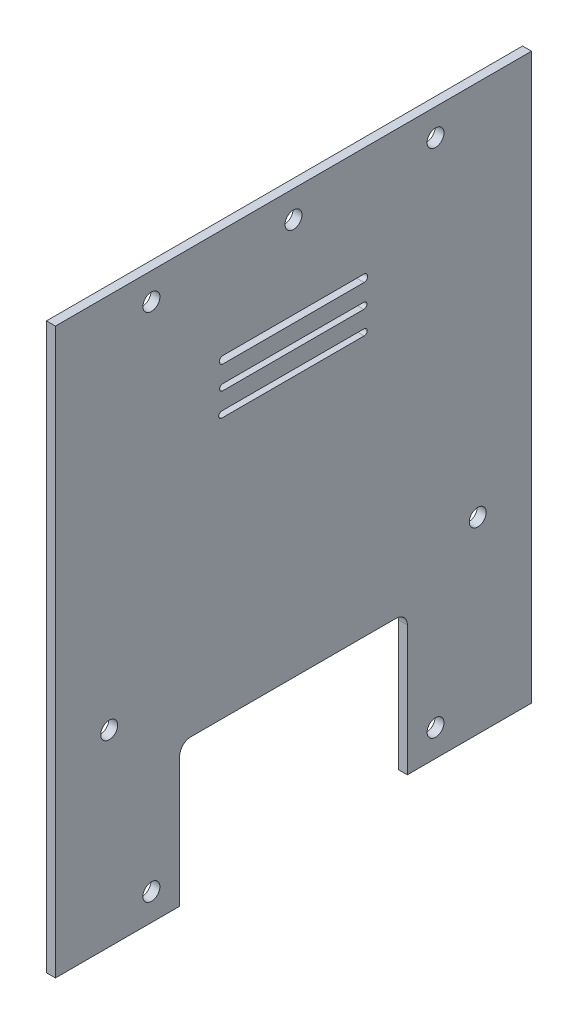
ISO-10303-21;
HEADER;
FILE_DESCRIPTION(('STEP AP214'),'2;1');
FILE_NAME('part.step','',(''),(''),'','','');
FILE_SCHEMA(('AUTOMOTIVE_DESIGN { 1 0 10303 214 1 1 1 1 }'));
ENDSEC;
DATA;
#1=APPLICATION_CONTEXT('core data for automotive mechanical design processes');
#2=APPLICATION_PROTOCOL_DEFINITION('international standard','automotive_design',2000,#1);
#3=PRODUCT_CONTEXT('',#1,'mechanical');
#4=PRODUCT('Part','Part','',(#3));
#5=PRODUCT_RELATED_PRODUCT_CATEGORY('part','',(#4));
#6=PRODUCT_DEFINITION_FORMATION('','',#4);
#7=PRODUCT_DEFINITION_CONTEXT('part definition',#1,'design');
#8=PRODUCT_DEFINITION('design','',#6,#7);
#9=PRODUCT_DEFINITION_SHAPE('','',#8);
#10=(LENGTH_UNIT() NAMED_UNIT(*) SI_UNIT(.MILLI.,.METRE.));
#11=(NAMED_UNIT(*) PLANE_ANGLE_UNIT() SI_UNIT($,.RADIAN.));
#12=(NAMED_UNIT(*) SI_UNIT($,.STERADIAN.) SOLID_ANGLE_UNIT());
#13=UNCERTAINTY_MEASURE_WITH_UNIT(LENGTH_MEASURE(1.E-05),#10,'distance_accuracy_value','');
#14=(GEOMETRIC_REPRESENTATION_CONTEXT(3) GLOBAL_UNCERTAINTY_ASSIGNED_CONTEXT((#13)) GLOBAL_UNIT_ASSIGNED_CONTEXT((#10,
#11,#12)) REPRESENTATION_CONTEXT('',''));
#15=CARTESIAN_POINT('',(0.,0.,0.));
#16=DIRECTION('',(0.,0.,1.));
#17=DIRECTION('',(1.,0.,0.));
#18=AXIS2_PLACEMENT_3D('',#15,#16,#17);
#19=CARTESIAN_POINT('',(111.95685789838,104.762,-123.291083719098));
#20=DIRECTION('',(1.,0.,0.));
#21=DIRECTION('',(0.,0.,-1.));
#22=AXIS2_PLACEMENT_3D('',#19,#20,#21);
#23=CYLINDRICAL_SURFACE('',#22,3.32740000005567);
#24=DIRECTION('',(1.,0.,0.));
#25=VECTOR('',#24,1.);
#26=CARTESIAN_POINT('',(111.95685789838,104.81359224748,-119.964083719043));
#27=LINE('',#26,#25);
#28=CARTESIAN_POINT('',(113.54485789838,104.813592247502,-119.964083719043));
#29=VERTEX_POINT('',#28);
#30=CARTESIAN_POINT('',(111.95685789838,104.813592247502,-119.964083719043));
#31=VERTEX_POINT('',#30);
#32=EDGE_CURVE('E196',#29,#31,#27,.F.);
#33=ORIENTED_EDGE('',*,*,#32,.F.);
#34=CARTESIAN_POINT('',(113.54485789838,104.762,-123.291083719098));
#35=DIRECTION('',(1.,0.,0.));
#36=DIRECTION('',(0.,0.,-1.));
#37=AXIS2_PLACEMENT_3D('',#34,#35,#36);
#38=CIRCLE('',#37,3.32740000005567);
#39=CARTESIAN_POINT('',(113.54485789838,104.710407752498,-119.964083719043));
#40=VERTEX_POINT('',#39);
#41=EDGE_CURVE('E20',#40,#29,#38,.F.);
#42=ORIENTED_EDGE('',*,*,#41,.F.);
#43=DIRECTION('',(1.,0.,0.));
#44=VECTOR('',#43,1.);
#45=CARTESIAN_POINT('',(111.95685789838,104.71040775252,-119.964083719043));
#46=LINE('',#45,#44);
#47=CARTESIAN_POINT('',(111.95685789838,104.710407752499,-119.964083719043));
#48=VERTEX_POINT('',#47);
#49=EDGE_CURVE('E223',#48,#40,#46,.T.);
#50=ORIENTED_EDGE('',*,*,#49,.F.);
#51=CARTESIAN_POINT('',(111.95685789838,104.762,-123.291083719098));
#52=DIRECTION('',(1.,0.,0.));
#53=DIRECTION('',(0.,0.,-1.));
#54=AXIS2_PLACEMENT_3D('',#51,#52,#53);
#55=CIRCLE('',#54,3.32740000005567);
#56=EDGE_CURVE('E268',#48,#31,#55,.F.);
#57=ORIENTED_EDGE('',*,*,#56,.T.);
#58=EDGE_LOOP('',(#33,#42,#50,#57));
#59=FACE_BOUND('',#58,.T.);
#60=ADVANCED_FACE('F17',(#59),#23,.F.);
#61=CARTESIAN_POINT('',(111.95685789838,59.525,-77.8015837190426));
#62=DIRECTION('',(1.,0.,0.));
#63=DIRECTION('',(0.,0.,-1.));
#64=AXIS2_PLACEMENT_3D('',#61,#62,#63);
#65=PLANE('',#64);
#66=CARTESIAN_POINT('',(111.95685789838,14.2875,-52.6390837190426));
#67=DIRECTION('',(1.,0.,0.));
#68=DIRECTION('',(0.,0.,-1.));
#69=AXIS2_PLACEMENT_3D('',#66,#67,#68);
#70=CIRCLE('',#69,1.5);
#71=CARTESIAN_POINT('',(111.95685789838,14.2875,-54.1390837190426));
#72=VERTEX_POINT('',#71);
#73=EDGE_CURVE('E358',#72,#72,#70,.T.);
#74=ORIENTED_EDGE('',*,*,#73,.T.);
#75=EDGE_LOOP('',(#74));
#76=FACE_BOUND('',#75,.T.);
#77=CARTESIAN_POINT('',(111.95685789838,104.7625,-52.6390837190426));
#78=DIRECTION('',(1.,0.,0.));
#79=DIRECTION('',(0.,0.,-1.));
#80=AXIS2_PLACEMENT_3D('',#77,#78,#79);
#81=CIRCLE('',#80,1.5);
#82=CARTESIAN_POINT('',(111.95685789838,104.7625,-54.1390837190426));
#83=VERTEX_POINT('',#82);
#84=EDGE_CURVE('E355',#83,#83,#81,.T.);
#85=ORIENTED_EDGE('',*,*,#84,.T.);
#86=EDGE_LOOP('',(#85));
#87=FACE_BOUND('',#86,.T.);
#88=CARTESIAN_POINT('',(111.95685789838,14.2875,-102.964083719043));
#89=DIRECTION('',(1.,0.,0.));
#90=DIRECTION('',(0.,0.,-1.));
#91=AXIS2_PLACEMENT_3D('',#88,#89,#90);
#92=CIRCLE('',#91,1.5);
#93=CARTESIAN_POINT('',(111.95685789838,14.2875,-104.464083719043));
#94=VERTEX_POINT('',#93);
#95=EDGE_CURVE('E352',#94,#94,#92,.T.);
#96=ORIENTED_EDGE('',*,*,#95,.T.);
#97=EDGE_LOOP('',(#96));
#98=FACE_BOUND('',#97,.T.);
#99=CARTESIAN_POINT('',(111.95685789838,104.7625,-77.8015837190426));
#100=DIRECTION('',(1.,0.,0.));
#101=DIRECTION('',(0.,0.,-1.));
#102=AXIS2_PLACEMENT_3D('',#99,#100,#101);
#103=CIRCLE('',#102,1.5);
#104=CARTESIAN_POINT('',(111.95685789838,104.7625,-79.3015837190426));
#105=VERTEX_POINT('',#104);
#106=EDGE_CURVE('E349',#105,#105,#103,.T.);
#107=ORIENTED_EDGE('',*,*,#106,.T.);
#108=EDGE_LOOP('',(#107));
#109=FACE_BOUND('',#108,.T.);
#110=CARTESIAN_POINT('',(111.95685789838,104.7625,-102.964083719043));
#111=DIRECTION('',(1.,0.,0.));
#112=DIRECTION('',(0.,0.,-1.));
#113=AXIS2_PLACEMENT_3D('',#110,#111,#112);
#114=CIRCLE('',#113,1.5);
#115=CARTESIAN_POINT('',(111.95685789838,104.7625,-104.464083719043));
#116=VERTEX_POINT('',#115);
#117=EDGE_CURVE('E346',#116,#116,#114,.T.);
#118=ORIENTED_EDGE('',*,*,#117,.T.);
#119=EDGE_LOOP('',(#118));
#120=FACE_BOUND('',#119,.T.);
#121=CARTESIAN_POINT('',(111.95685789838,81.225,-90.3185438285447));
#122=DIRECTION('',(-1.,0.,0.));
#123=DIRECTION('',(0.,0.,1.));
#124=AXIS2_PLACEMENT_3D('',#121,#122,#123);
#125=CIRCLE('',#124,0.549999999999997);
#126=CARTESIAN_POINT('',(111.95685789838,80.675,-90.3185438285447));
#127=VERTEX_POINT('',#126);
#128=CARTESIAN_POINT('',(111.95685789838,81.775,-90.3185438285447));
#129=VERTEX_POINT('',#128);
#130=EDGE_CURVE('E361',#127,#129,#125,.F.);
#131=ORIENTED_EDGE('',*,*,#130,.T.);
#132=DIRECTION('',(0.,0.,1.));
#133=VECTOR('',#132,1.);
#134=CARTESIAN_POINT('',(111.95685789838,81.775,-65.0955161721386));
#135=LINE('',#134,#133);
#136=CARTESIAN_POINT('',(111.95685789838,81.775,-65.0955161721386));
#137=VERTEX_POINT('',#136);
#138=EDGE_CURVE('E241',#129,#137,#135,.T.);
#139=ORIENTED_EDGE('',*,*,#138,.T.);
#140=CARTESIAN_POINT('',(111.95685789838,81.225,-65.0955161721386));
#141=DIRECTION('',(-1.,0.,0.));
#142=DIRECTION('',(0.,0.,1.));
#143=AXIS2_PLACEMENT_3D('',#140,#141,#142);
#144=CIRCLE('',#143,0.549999999999979);
#145=CARTESIAN_POINT('',(111.95685789838,80.675,-65.0955161721386));
#146=VERTEX_POINT('',#145);
#147=EDGE_CURVE('E365',#137,#146,#144,.F.);
#148=ORIENTED_EDGE('',*,*,#147,.T.);
#149=DIRECTION('',(0.,0.,-1.));
#150=VECTOR('',#149,1.);
#151=CARTESIAN_POINT('',(111.95685789838,80.675,-90.3185438285447));
#152=LINE('',#151,#150);
#153=EDGE_CURVE('E237',#146,#127,#152,.T.);
#154=ORIENTED_EDGE('',*,*,#153,.T.);
#155=EDGE_LOOP('',(#131,#139,#148,#154));
#156=FACE_BOUND('',#155,.T.);
#157=CARTESIAN_POINT('',(111.95685789838,85.325,-90.2649355778327));
#158=DIRECTION('',(-1.,0.,0.));
#159=DIRECTION('',(0.,0.,1.));
#160=AXIS2_PLACEMENT_3D('',#157,#158,#159);
#161=CIRCLE('',#160,0.549999999999997);
#162=CARTESIAN_POINT('',(111.95685789838,84.775,-90.2649355778327));
#163=VERTEX_POINT('',#162);
#164=CARTESIAN_POINT('',(111.95685789838,85.875,-90.2649355778327));
#165=VERTEX_POINT('',#164);
#166=EDGE_CURVE('E240',#163,#165,#161,.F.);
#167=ORIENTED_EDGE('',*,*,#166,.T.);
#168=DIRECTION('',(0.,0.,1.));
#169=VECTOR('',#168,1.);
#170=CARTESIAN_POINT('',(111.95685789838,85.875,-65.2649355778327));
#171=LINE('',#170,#169);
#172=CARTESIAN_POINT('',(111.95685789838,85.875,-65.2649355778327));
#173=VERTEX_POINT('',#172);
#174=EDGE_CURVE('E249',#165,#173,#171,.T.);
#175=ORIENTED_EDGE('',*,*,#174,.T.);
#176=CARTESIAN_POINT('',(111.95685789838,85.325,-65.2649355778327));
#177=DIRECTION('',(-1.,0.,0.));
#178=DIRECTION('',(0.,0.,1.));
#179=AXIS2_PLACEMENT_3D('',#176,#177,#178);
#180=CIRCLE('',#179,0.549999999999997);
#181=CARTESIAN_POINT('',(111.95685789838,84.775,-65.2649355778327));
#182=VERTEX_POINT('',#181);
#183=EDGE_CURVE('E371',#173,#182,#180,.F.);
#184=ORIENTED_EDGE('',*,*,#183,.T.);
#185=DIRECTION('',(0.,0.,-1.));
#186=VECTOR('',#185,1.);
#187=CARTESIAN_POINT('',(111.95685789838,84.775,-90.2649355778327));
#188=LINE('',#187,#186);
#189=EDGE_CURVE('E245',#182,#163,#188,.T.);
#190=ORIENTED_EDGE('',*,*,#189,.T.);
#191=EDGE_LOOP('',(#167,#175,#184,#190));
#192=FACE_BOUND('',#191,.T.);
#193=CARTESIAN_POINT('',(111.95685789838,89.525,-90.3015837190426));
#194=DIRECTION('',(-1.,0.,0.));
#195=DIRECTION('',(0.,0.,1.));
#196=AXIS2_PLACEMENT_3D('',#193,#194,#195);
#197=CIRCLE('',#196,0.649999999999995);
#198=CARTESIAN_POINT('',(111.95685789838,88.875,-90.3015837190426));
#199=VERTEX_POINT('',#198);
#200=CARTESIAN_POINT('',(111.95685789838,90.175,-90.3015837190426));
#201=VERTEX_POINT('',#200);
#202=EDGE_CURVE('E248',#199,#201,#197,.F.);
#203=ORIENTED_EDGE('',*,*,#202,.T.);
#204=DIRECTION('',(0.,0.,1.));
#205=VECTOR('',#204,1.);
#206=CARTESIAN_POINT('',(111.95685789838,90.175,-65.3015837190426));
#207=LINE('',#206,#205);
#208=CARTESIAN_POINT('',(111.95685789838,90.175,-65.3015837190426));
#209=VERTEX_POINT('',#208);
#210=EDGE_CURVE('E258',#201,#209,#207,.T.);
#211=ORIENTED_EDGE('',*,*,#210,.T.);
#212=CARTESIAN_POINT('',(111.95685789838,89.525,-65.3015837190426));
#213=DIRECTION('',(-1.,0.,0.));
#214=DIRECTION('',(0.,0.,1.));
#215=AXIS2_PLACEMENT_3D('',#212,#213,#214);
#216=CIRCLE('',#215,0.649999999999995);
#217=CARTESIAN_POINT('',(111.95685789838,88.875,-65.3015837190426));
#218=VERTEX_POINT('',#217);
#219=EDGE_CURVE('E377',#209,#218,#216,.F.);
#220=ORIENTED_EDGE('',*,*,#219,.T.);
#221=DIRECTION('',(0.,0.,-1.));
#222=VECTOR('',#221,1.);
#223=CARTESIAN_POINT('',(111.95685789838,88.875,-90.3015837190426));
#224=LINE('',#223,#222);
#225=EDGE_CURVE('E254',#218,#199,#224,.T.);
#226=ORIENTED_EDGE('',*,*,#225,.T.);
#227=EDGE_LOOP('',(#203,#211,#220,#226));
#228=FACE_BOUND('',#227,.T.);
#229=CARTESIAN_POINT('',(111.95685789838,42.8129999999999,-110.439083719043));
#230=DIRECTION('',(1.,0.,0.));
#231=DIRECTION('',(0.,0.,-1.));
#232=AXIS2_PLACEMENT_3D('',#229,#230,#231);
#233=CIRCLE('',#232,1.5);
#234=CARTESIAN_POINT('',(111.95685789838,42.8129999999999,-111.939083719043));
#235=VERTEX_POINT('',#234);
#236=EDGE_CURVE('E257',#235,#235,#233,.T.);
#237=ORIENTED_EDGE('',*,*,#236,.T.);
#238=EDGE_LOOP('',(#237));
#239=FACE_BOUND('',#238,.T.);
#240=CARTESIAN_POINT('',(111.95685789838,42.8129999999999,-45.1640837190423));
#241=DIRECTION('',(1.,0.,0.));
#242=DIRECTION('',(0.,0.,-1.));
#243=AXIS2_PLACEMENT_3D('',#240,#241,#242);
#244=CIRCLE('',#243,1.5);
#245=CARTESIAN_POINT('',(111.95685789838,42.8129999999999,-46.6640837190423));
#246=VERTEX_POINT('',#245);
#247=EDGE_CURVE('E382',#246,#246,#244,.T.);
#248=ORIENTED_EDGE('',*,*,#247,.T.);
#249=EDGE_LOOP('',(#248));
#250=FACE_BOUND('',#249,.T.);
#251=CARTESIAN_POINT('',(111.95685789838,32.525,-95.9640837190426));
#252=DIRECTION('',(-1.,0.,0.));
#253=DIRECTION('',(0.,0.,1.));
#254=AXIS2_PLACEMENT_3D('',#251,#252,#253);
#255=CIRCLE('',#254,2.);
#256=CARTESIAN_POINT('',(111.95685789838,32.525,-97.9640837190426));
#257=VERTEX_POINT('',#256);
#258=CARTESIAN_POINT('',(111.95685789838,34.525,-95.9640837190426));
#259=VERTEX_POINT('',#258);
#260=EDGE_CURVE('E386',#257,#259,#255,.F.);
#261=ORIENTED_EDGE('',*,*,#260,.T.);
#262=DIRECTION('',(0.,0.,1.));
#263=VECTOR('',#262,1.);
#264=CARTESIAN_POINT('',(111.95685789838,34.525,-57.6390837190426));
#265=LINE('',#264,#263);
#266=CARTESIAN_POINT('',(111.95685789838,34.525,-59.6390837190426));
#267=VERTEX_POINT('',#266);
#268=EDGE_CURVE('E263',#259,#267,#265,.T.);
#269=ORIENTED_EDGE('',*,*,#268,.T.);
#270=CARTESIAN_POINT('',(111.95685789838,32.525,-59.6390837190426));
#271=DIRECTION('',(-1.,0.,0.));
#272=DIRECTION('',(0.,0.,1.));
#273=AXIS2_PLACEMENT_3D('',#270,#271,#272);
#274=CIRCLE('',#273,2.);
#275=CARTESIAN_POINT('',(111.95685789838,32.525,-57.6390837190426));
#276=VERTEX_POINT('',#275);
#277=EDGE_CURVE('E389',#267,#276,#274,.F.);
#278=ORIENTED_EDGE('',*,*,#277,.T.);
#279=DIRECTION('',(0.,1.,0.));
#280=VECTOR('',#279,1.);
#281=CARTESIAN_POINT('',(111.95685789838,9.52500000000001,-57.6390837190426));
#282=LINE('',#281,#280);
#283=CARTESIAN_POINT('',(111.95685789838,9.52500000000001,-57.6390837190426));
#284=VERTEX_POINT('',#283);
#285=EDGE_CURVE('E271',#276,#284,#282,.F.);
#286=ORIENTED_EDGE('',*,*,#285,.T.);
#287=DIRECTION('',(0.,0.,-1.));
#288=VECTOR('',#287,1.);
#289=CARTESIAN_POINT('',(111.95685789838,9.525,-35.6390837190426));
#290=LINE('',#289,#288);
#291=CARTESIAN_POINT('',(111.95685789838,9.525,-35.6390837190426));
#292=VERTEX_POINT('',#291);
#293=EDGE_CURVE('E274',#292,#284,#290,.T.);
#294=ORIENTED_EDGE('',*,*,#293,.F.);
#295=DIRECTION('',(0.,-1.,0.));
#296=VECTOR('',#295,1.);
#297=CARTESIAN_POINT('',(111.95685789838,109.525,-35.6390837190426));
#298=LINE('',#297,#296);
#299=CARTESIAN_POINT('',(111.95685789838,109.525,-35.6390837190426));
#300=VERTEX_POINT('',#299);
#301=EDGE_CURVE('E191',#300,#292,#298,.T.);
#302=ORIENTED_EDGE('',*,*,#301,.F.);
#303=DIRECTION('',(0.,0.,1.));
#304=VECTOR('',#303,1.);
#305=CARTESIAN_POINT('',(111.95685789838,109.525,-119.964083719043));
#306=LINE('',#305,#304);
#307=CARTESIAN_POINT('',(111.95685789838,109.525,-119.964083719043));
#308=VERTEX_POINT('',#307);
#309=EDGE_CURVE('E185',#308,#300,#306,.T.);
#310=ORIENTED_EDGE('',*,*,#309,.F.);
#311=DIRECTION('',(0.,1.,0.));
#312=VECTOR('',#311,1.);
#313=CARTESIAN_POINT('',(111.95685789838,104.81359224748,-119.964083719043));
#314=LINE('',#313,#312);
#315=EDGE_CURVE('E188',#31,#308,#314,.T.);
#316=ORIENTED_EDGE('',*,*,#315,.F.);
#317=ORIENTED_EDGE('',*,*,#56,.F.);
#318=DIRECTION('',(0.,1.,0.));
#319=VECTOR('',#318,1.);
#320=CARTESIAN_POINT('',(111.95685789838,9.52500000000001,-119.964083719043));
#321=LINE('',#320,#319);
#322=CARTESIAN_POINT('',(111.95685789838,9.52500000000001,-119.964083719043));
#323=VERTEX_POINT('',#322);
#324=EDGE_CURVE('E289',#323,#48,#321,.T.);
#325=ORIENTED_EDGE('',*,*,#324,.F.);
#326=DIRECTION('',(0.,0.,-1.));
#327=VECTOR('',#326,1.);
#328=CARTESIAN_POINT('',(111.95685789838,9.525,-35.6390837190426));
#329=LINE('',#328,#327);
#330=CARTESIAN_POINT('',(111.95685789838,9.52500000000001,-97.9640837190426));
#331=VERTEX_POINT('',#330);
#332=EDGE_CURVE('E233',#331,#323,#329,.T.);
#333=ORIENTED_EDGE('',*,*,#332,.F.);
#334=DIRECTION('',(0.,1.,0.));
#335=VECTOR('',#334,1.);
#336=CARTESIAN_POINT('',(111.95685789838,34.525,-97.9640837190426));
#337=LINE('',#336,#335);
#338=EDGE_CURVE('E234',#331,#257,#337,.T.);
#339=ORIENTED_EDGE('',*,*,#338,.T.);
#340=EDGE_LOOP('',(#261,#269,#278,#286,#294,#302,#310,#316,#317,#325,#333,#339));
#341=FACE_BOUND('',#340,.T.);
#342=ADVANCED_FACE('F187',(#76,#87,#98,#109,#120,#156,#192,#228,#239,#250,#341),#65,.F.);
#343=CARTESIAN_POINT('',(113.54485789838,34.525,-97.9640837190426));
#344=DIRECTION('',(0.,0.,-1.));
#345=DIRECTION('',(-1.,0.,0.));
#346=AXIS2_PLACEMENT_3D('',#343,#344,#345);
#347=PLANE('',#346);
#348=ORIENTED_EDGE('',*,*,#338,.F.);
#349=DIRECTION('',(1.,0.,0.));
#350=VECTOR('',#349,1.);
#351=CARTESIAN_POINT('',(111.95685789838,9.52500000000001,-97.9640837190426));
#352=LINE('',#351,#350);
#353=CARTESIAN_POINT('',(113.54485789838,9.52500000000001,-97.9640837190426));
#354=VERTEX_POINT('',#353);
#355=EDGE_CURVE('E230',#354,#331,#352,.F.);
#356=ORIENTED_EDGE('',*,*,#355,.F.);
#357=DIRECTION('',(0.,1.,0.));
#358=VECTOR('',#357,1.);
#359=CARTESIAN_POINT('',(113.54485789838,59.525,-97.9640837190426));
#360=LINE('',#359,#358);
#361=CARTESIAN_POINT('',(113.54485789838,32.525,-97.9640837190426));
#362=VERTEX_POINT('',#361);
#363=EDGE_CURVE('E227',#362,#354,#360,.F.);
#364=ORIENTED_EDGE('',*,*,#363,.F.);
#365=DIRECTION('',(-1.,0.,0.));
#366=VECTOR('',#365,1.);
#367=CARTESIAN_POINT('',(113.54485789838,32.525,-97.9640837190426));
#368=LINE('',#367,#366);
#369=EDGE_CURVE('E388',#362,#257,#368,.T.);
#370=ORIENTED_EDGE('',*,*,#369,.T.);
#371=EDGE_LOOP('',(#348,#356,#364,#370));
#372=FACE_BOUND('',#371,.T.);
#373=ADVANCED_FACE('F398',(#372),#347,.F.);
#374=CARTESIAN_POINT('',(111.95685789838,9.525,-35.6390837190426));
#375=DIRECTION('',(0.,-1.,0.));
#376=DIRECTION('',(0.,0.,-1.));
#377=AXIS2_PLACEMENT_3D('',#374,#375,#376);
#378=PLANE('',#377);
#379=DIRECTION('',(1.,0.,0.));
#380=VECTOR('',#379,1.);
#381=CARTESIAN_POINT('',(111.95685789838,9.52500000000001,-119.964083719043));
#382=LINE('',#381,#380);
#383=CARTESIAN_POINT('',(113.54485789838,9.52500000000001,-119.964083719043));
#384=VERTEX_POINT('',#383);
#385=EDGE_CURVE('E157',#384,#323,#382,.F.);
#386=ORIENTED_EDGE('',*,*,#385,.F.);
#387=DIRECTION('',(0.,0.,-1.));
#388=VECTOR('',#387,1.);
#389=CARTESIAN_POINT('',(113.54485789838,9.52500000000001,-77.8015837190426));
#390=LINE('',#389,#388);
#391=EDGE_CURVE('E224',#354,#384,#390,.T.);
#392=ORIENTED_EDGE('',*,*,#391,.F.);
#393=ORIENTED_EDGE('',*,*,#355,.T.);
#394=ORIENTED_EDGE('',*,*,#332,.T.);
#395=EDGE_LOOP('',(#386,#392,#393,#394));
#396=FACE_BOUND('',#395,.T.);
#397=ADVANCED_FACE('F513',(#396),#378,.T.);
#398=CARTESIAN_POINT('',(111.95685789838,9.52500000000001,-119.964083719043));
#399=DIRECTION('',(0.,0.,-1.));
#400=DIRECTION('',(0.,1.,0.));
#401=AXIS2_PLACEMENT_3D('',#398,#399,#400);
#402=PLANE('',#401);
#403=DIRECTION('',(0.,1.,0.));
#404=VECTOR('',#403,1.);
#405=CARTESIAN_POINT('',(113.54485789838,59.525,-119.964083719043));
#406=LINE('',#405,#404);
#407=EDGE_CURVE('E218',#384,#40,#406,.T.);
#408=ORIENTED_EDGE('',*,*,#407,.F.);
#409=ORIENTED_EDGE('',*,*,#385,.T.);
#410=ORIENTED_EDGE('',*,*,#324,.T.);
#411=ORIENTED_EDGE('',*,*,#49,.T.);
#412=EDGE_LOOP('',(#408,#409,#410,#411));
#413=FACE_BOUND('',#412,.T.);
#414=ADVANCED_FACE('F510',(#413),#402,.T.);
#415=CARTESIAN_POINT('',(111.95685789838,104.81359224748,-119.964083719043));
#416=DIRECTION('',(0.,0.,-1.));
#417=DIRECTION('',(0.,1.,0.));
#418=AXIS2_PLACEMENT_3D('',#415,#416,#417);
#419=PLANE('',#418);
#420=DIRECTION('',(0.,1.,0.));
#421=VECTOR('',#420,1.);
#422=CARTESIAN_POINT('',(113.54485789838,59.525,-119.964083719043));
#423=LINE('',#422,#421);
#424=CARTESIAN_POINT('',(113.54485789838,109.525,-119.964083719043));
#425=VERTEX_POINT('',#424);
#426=EDGE_CURVE('E216',#29,#425,#423,.T.);
#427=ORIENTED_EDGE('',*,*,#426,.F.);
#428=ORIENTED_EDGE('',*,*,#32,.T.);
#429=ORIENTED_EDGE('',*,*,#315,.T.);
#430=DIRECTION('',(1.,0.,0.));
#431=VECTOR('',#430,1.);
#432=CARTESIAN_POINT('',(111.95685789838,109.525,-119.964083719043));
#433=LINE('',#432,#431);
#434=EDGE_CURVE('E195',#425,#308,#433,.F.);
#435=ORIENTED_EDGE('',*,*,#434,.F.);
#436=EDGE_LOOP('',(#427,#428,#429,#435));
#437=FACE_BOUND('',#436,.T.);
#438=ADVANCED_FACE('F200',(#437),#419,.T.);
#439=CARTESIAN_POINT('',(111.95685789838,109.525,-119.964083719043));
#440=DIRECTION('',(0.,1.,0.));
#441=DIRECTION('',(0.,0.,1.));
#442=AXIS2_PLACEMENT_3D('',#439,#440,#441);
#443=PLANE('',#442);
#444=DIRECTION('',(0.,0.,-1.));
#445=VECTOR('',#444,1.);
#446=CARTESIAN_POINT('',(113.54485789838,109.525,-77.8015837190426));
#447=LINE('',#446,#445);
#448=CARTESIAN_POINT('',(113.54485789838,109.525,-35.6390837190426));
#449=VERTEX_POINT('',#448);
#450=EDGE_CURVE('E205',#425,#449,#447,.F.);
#451=ORIENTED_EDGE('',*,*,#450,.F.);
#452=ORIENTED_EDGE('',*,*,#434,.T.);
#453=ORIENTED_EDGE('',*,*,#309,.T.);
#454=DIRECTION('',(1.,0.,0.));
#455=VECTOR('',#454,1.);
#456=CARTESIAN_POINT('',(111.95685789838,109.525,-35.6390837190426));
#457=LINE('',#456,#455);
#458=EDGE_CURVE('E208',#449,#300,#457,.F.);
#459=ORIENTED_EDGE('',*,*,#458,.F.);
#460=EDGE_LOOP('',(#451,#452,#453,#459));
#461=FACE_BOUND('',#460,.T.);
#462=ADVANCED_FACE('F203',(#461),#443,.T.);
#463=CARTESIAN_POINT('',(111.95685789838,109.525,-35.6390837190426));
#464=DIRECTION('',(0.,0.,1.));
#465=DIRECTION('',(0.,-1.,0.));
#466=AXIS2_PLACEMENT_3D('',#463,#464,#465);
#467=PLANE('',#466);
#468=DIRECTION('',(0.,1.,0.));
#469=VECTOR('',#468,1.);
#470=CARTESIAN_POINT('',(113.54485789838,59.525,-35.6390837190426));
#471=LINE('',#470,#469);
#472=CARTESIAN_POINT('',(113.54485789838,9.525,-35.6390837190426));
#473=VERTEX_POINT('',#472);
#474=EDGE_CURVE('E560',#449,#473,#471,.F.);
#475=ORIENTED_EDGE('',*,*,#474,.F.);
#476=ORIENTED_EDGE('',*,*,#458,.T.);
#477=ORIENTED_EDGE('',*,*,#301,.T.);
#478=DIRECTION('',(1.,0.,0.));
#479=VECTOR('',#478,1.);
#480=CARTESIAN_POINT('',(111.95685789838,9.525,-35.6390837190426));
#481=LINE('',#480,#479);
#482=EDGE_CURVE('E279',#473,#292,#481,.F.);
#483=ORIENTED_EDGE('',*,*,#482,.F.);
#484=EDGE_LOOP('',(#475,#476,#477,#483));
#485=FACE_BOUND('',#484,.T.);
#486=ADVANCED_FACE('F501',(#485),#467,.T.);
#487=CARTESIAN_POINT('',(111.95685789838,9.525,-35.6390837190426));
#488=DIRECTION('',(0.,-1.,0.));
#489=DIRECTION('',(0.,0.,-1.));
#490=AXIS2_PLACEMENT_3D('',#487,#488,#489);
#491=PLANE('',#490);
#492=ORIENTED_EDGE('',*,*,#482,.T.);
#493=ORIENTED_EDGE('',*,*,#293,.T.);
#494=DIRECTION('',(1.,0.,0.));
#495=VECTOR('',#494,1.);
#496=CARTESIAN_POINT('',(113.54485789838,9.52500000000001,-57.6390837190426));
#497=LINE('',#496,#495);
#498=CARTESIAN_POINT('',(113.54485789838,9.525,-57.6390837190426));
#499=VERTEX_POINT('',#498);
#500=EDGE_CURVE('E273',#284,#499,#497,.T.);
#501=ORIENTED_EDGE('',*,*,#500,.T.);
#502=DIRECTION('',(0.,0.,-1.));
#503=VECTOR('',#502,1.);
#504=CARTESIAN_POINT('',(113.54485789838,9.525,-77.8015837190426));
#505=LINE('',#504,#503);
#506=EDGE_CURVE('E557',#473,#499,#505,.T.);
#507=ORIENTED_EDGE('',*,*,#506,.F.);
#508=EDGE_LOOP('',(#492,#493,#501,#507));
#509=FACE_BOUND('',#508,.T.);
#510=ADVANCED_FACE('F497',(#509),#491,.T.);
#511=CARTESIAN_POINT('',(113.54485789838,9.52500000000001,-57.6390837190426));
#512=DIRECTION('',(0.,0.,1.));
#513=DIRECTION('',(1.,0.,0.));
#514=AXIS2_PLACEMENT_3D('',#511,#512,#513);
#515=PLANE('',#514);
#516=DIRECTION('',(0.,1.,0.));
#517=VECTOR('',#516,1.);
#518=CARTESIAN_POINT('',(113.54485789838,59.525,-57.6390837190426));
#519=LINE('',#518,#517);
#520=CARTESIAN_POINT('',(113.54485789838,32.525,-57.6390837190426));
#521=VERTEX_POINT('',#520);
#522=EDGE_CURVE('E345',#499,#521,#519,.T.);
#523=ORIENTED_EDGE('',*,*,#522,.F.);
#524=ORIENTED_EDGE('',*,*,#500,.F.);
#525=ORIENTED_EDGE('',*,*,#285,.F.);
#526=DIRECTION('',(-1.,0.,0.));
#527=VECTOR('',#526,1.);
#528=CARTESIAN_POINT('',(113.54485789838,32.525,-57.6390837190426));
#529=LINE('',#528,#527);
#530=EDGE_CURVE('E266',#276,#521,#529,.F.);
#531=ORIENTED_EDGE('',*,*,#530,.T.);
#532=EDGE_LOOP('',(#523,#524,#525,#531));
#533=FACE_BOUND('',#532,.T.);
#534=ADVANCED_FACE('F493',(#533),#515,.F.);
#535=CARTESIAN_POINT('',(113.54485789838,32.525,-59.6390837190426));
#536=DIRECTION('',(-1.,0.,0.));
#537=DIRECTION('',(0.,0.,1.));
#538=AXIS2_PLACEMENT_3D('',#535,#536,#537);
#539=CYLINDRICAL_SURFACE('',#538,2.);
#540=ORIENTED_EDGE('',*,*,#530,.F.);
#541=ORIENTED_EDGE('',*,*,#277,.F.);
#542=DIRECTION('',(1.,0.,0.));
#543=VECTOR('',#542,1.);
#544=CARTESIAN_POINT('',(113.54485789838,34.525,-59.6390837190426));
#545=LINE('',#544,#543);
#546=CARTESIAN_POINT('',(113.54485789838,34.525,-59.6390837190426));
#547=VERTEX_POINT('',#546);
#548=EDGE_CURVE('E265',#267,#547,#545,.T.);
#549=ORIENTED_EDGE('',*,*,#548,.T.);
#550=CARTESIAN_POINT('',(113.54485789838,32.525,-59.6390837190426));
#551=DIRECTION('',(-1.,0.,0.));
#552=DIRECTION('',(0.,0.,1.));
#553=AXIS2_PLACEMENT_3D('',#550,#551,#552);
#554=CIRCLE('',#553,2.);
#555=EDGE_CURVE('E342',#521,#547,#554,.T.);
#556=ORIENTED_EDGE('',*,*,#555,.F.);
#557=EDGE_LOOP('',(#540,#541,#549,#556));
#558=FACE_BOUND('',#557,.T.);
#559=ADVANCED_FACE('F489',(#558),#539,.F.);
#560=CARTESIAN_POINT('',(113.54485789838,34.525,-57.6390837190426));
#561=DIRECTION('',(0.,1.,0.));
#562=DIRECTION('',(0.,0.,1.));
#563=AXIS2_PLACEMENT_3D('',#560,#561,#562);
#564=PLANE('',#563);
#565=ORIENTED_EDGE('',*,*,#268,.F.);
#566=DIRECTION('',(-1.,0.,0.));
#567=VECTOR('',#566,1.);
#568=CARTESIAN_POINT('',(113.54485789838,34.525,-95.9640837190426));
#569=LINE('',#568,#567);
#570=CARTESIAN_POINT('',(113.54485789838,34.525,-95.9640837190426));
#571=VERTEX_POINT('',#570);
#572=EDGE_CURVE('E385',#259,#571,#569,.F.);
#573=ORIENTED_EDGE('',*,*,#572,.T.);
#574=DIRECTION('',(0.,0.,-1.));
#575=VECTOR('',#574,1.);
#576=CARTESIAN_POINT('',(113.54485789838,34.525,-77.8015837190426));
#577=LINE('',#576,#575);
#578=EDGE_CURVE('E341',#547,#571,#577,.T.);
#579=ORIENTED_EDGE('',*,*,#578,.F.);
#580=ORIENTED_EDGE('',*,*,#548,.F.);
#581=EDGE_LOOP('',(#565,#573,#579,#580));
#582=FACE_BOUND('',#581,.T.);
#583=ADVANCED_FACE('F485',(#582),#564,.F.);
#584=CARTESIAN_POINT('',(113.54485789838,32.525,-95.9640837190426));
#585=DIRECTION('',(-1.,0.,0.));
#586=DIRECTION('',(0.,0.,1.));
#587=AXIS2_PLACEMENT_3D('',#584,#585,#586);
#588=CYLINDRICAL_SURFACE('',#587,2.);
#589=ORIENTED_EDGE('',*,*,#572,.F.);
#590=ORIENTED_EDGE('',*,*,#260,.F.);
#591=ORIENTED_EDGE('',*,*,#369,.F.);
#592=CARTESIAN_POINT('',(113.54485789838,32.525,-95.9640837190426));
#593=DIRECTION('',(-1.,0.,0.));
#594=DIRECTION('',(0.,0.,1.));
#595=AXIS2_PLACEMENT_3D('',#592,#593,#594);
#596=CIRCLE('',#595,2.);
#597=EDGE_CURVE('E338',#571,#362,#596,.T.);
#598=ORIENTED_EDGE('',*,*,#597,.F.);
#599=EDGE_LOOP('',(#589,#590,#591,#598));
#600=FACE_BOUND('',#599,.T.);
#601=ADVANCED_FACE('F481',(#600),#588,.F.);
#602=CARTESIAN_POINT('',(110.36885789838,42.8129999999999,-45.1640837190423));
#603=DIRECTION('',(1.,0.,0.));
#604=DIRECTION('',(0.,0.,-1.));
#605=AXIS2_PLACEMENT_3D('',#602,#603,#604);
#606=CYLINDRICAL_SURFACE('',#605,1.5);
#607=CARTESIAN_POINT('',(113.54485789838,42.8129999999999,-45.1640837190423));
#608=DIRECTION('',(1.,0.,0.));
#609=DIRECTION('',(0.,0.,-1.));
#610=AXIS2_PLACEMENT_3D('',#607,#608,#609);
#611=CIRCLE('',#610,1.5);
#612=CARTESIAN_POINT('',(113.54485789838,42.8129999999999,-46.6640837190423));
#613=VERTEX_POINT('',#612);
#614=EDGE_CURVE('E335',#613,#613,#611,.F.);
#615=ORIENTED_EDGE('',*,*,#614,.F.);
#616=EDGE_LOOP('',(#615));
#617=FACE_BOUND('',#616,.T.);
#618=ORIENTED_EDGE('',*,*,#247,.F.);
#619=EDGE_LOOP('',(#618));
#620=FACE_BOUND('',#619,.T.);
#621=ADVANCED_FACE('F477',(#617,#620),#606,.F.);
#622=CARTESIAN_POINT('',(110.36885789838,42.8129999999999,-110.439083719043));
#623=DIRECTION('',(1.,0.,0.));
#624=DIRECTION('',(0.,0.,-1.));
#625=AXIS2_PLACEMENT_3D('',#622,#623,#624);
#626=CYLINDRICAL_SURFACE('',#625,1.5);
#627=CARTESIAN_POINT('',(113.54485789838,42.8129999999999,-110.439083719043));
#628=DIRECTION('',(1.,0.,0.));
#629=DIRECTION('',(0.,0.,-1.));
#630=AXIS2_PLACEMENT_3D('',#627,#628,#629);
#631=CIRCLE('',#630,1.5);
#632=CARTESIAN_POINT('',(113.54485789838,42.8129999999999,-111.939083719043));
#633=VERTEX_POINT('',#632);
#634=EDGE_CURVE('E332',#633,#633,#631,.F.);
#635=ORIENTED_EDGE('',*,*,#634,.F.);
#636=EDGE_LOOP('',(#635));
#637=FACE_BOUND('',#636,.T.);
#638=ORIENTED_EDGE('',*,*,#236,.F.);
#639=EDGE_LOOP('',(#638));
#640=FACE_BOUND('',#639,.T.);
#641=ADVANCED_FACE('F473',(#637,#640),#626,.F.);
#642=CARTESIAN_POINT('',(113.54485789838,88.875,-90.3015837190426));
#643=DIRECTION('',(0.,-1.,0.));
#644=DIRECTION('',(0.,0.,-1.));
#645=AXIS2_PLACEMENT_3D('',#642,#643,#644);
#646=PLANE('',#645);
#647=DIRECTION('',(-1.,0.,0.));
#648=VECTOR('',#647,1.);
#649=CARTESIAN_POINT('',(113.54485789838,88.875,-65.3015837190426));
#650=LINE('',#649,#648);
#651=CARTESIAN_POINT('',(113.54485789838,88.875,-65.3015837190426));
#652=VERTEX_POINT('',#651);
#653=EDGE_CURVE('E256',#218,#652,#650,.F.);
#654=ORIENTED_EDGE('',*,*,#653,.T.);
#655=DIRECTION('',(0.,0.,-1.));
#656=VECTOR('',#655,1.);
#657=CARTESIAN_POINT('',(113.54485789838,88.875,-77.8015837190426));
#658=LINE('',#657,#656);
#659=CARTESIAN_POINT('',(113.54485789838,88.875,-90.3015837190426));
#660=VERTEX_POINT('',#659);
#661=EDGE_CURVE('E331',#660,#652,#658,.F.);
#662=ORIENTED_EDGE('',*,*,#661,.F.);
#663=DIRECTION('',(-1.,0.,0.));
#664=VECTOR('',#663,1.);
#665=CARTESIAN_POINT('',(113.54485789838,88.875,-90.3015837190426));
#666=LINE('',#665,#664);
#667=EDGE_CURVE('E376',#660,#199,#666,.T.);
#668=ORIENTED_EDGE('',*,*,#667,.T.);
#669=ORIENTED_EDGE('',*,*,#225,.F.);
#670=EDGE_LOOP('',(#654,#662,#668,#669));
#671=FACE_BOUND('',#670,.T.);
#672=ADVANCED_FACE('F469',(#671),#646,.F.);
#673=CARTESIAN_POINT('',(113.54485789838,89.525,-65.3015837190426));
#674=DIRECTION('',(-1.,0.,0.));
#675=DIRECTION('',(0.,0.,1.));
#676=AXIS2_PLACEMENT_3D('',#673,#674,#675);
#677=CYLINDRICAL_SURFACE('',#676,0.649999999999995);
#678=DIRECTION('',(1.,0.,0.));
#679=VECTOR('',#678,1.);
#680=CARTESIAN_POINT('',(113.54485789838,90.175,-65.3015837190426));
#681=LINE('',#680,#679);
#682=CARTESIAN_POINT('',(113.54485789838,90.175,-65.3015837190426));
#683=VERTEX_POINT('',#682);
#684=EDGE_CURVE('E262',#209,#683,#681,.T.);
#685=ORIENTED_EDGE('',*,*,#684,.T.);
#686=CARTESIAN_POINT('',(113.54485789838,89.525,-65.3015837190426));
#687=DIRECTION('',(-1.,0.,0.));
#688=DIRECTION('',(0.,0.,1.));
#689=AXIS2_PLACEMENT_3D('',#686,#687,#688);
#690=CIRCLE('',#689,0.649999999999995);
#691=EDGE_CURVE('E328',#652,#683,#690,.T.);
#692=ORIENTED_EDGE('',*,*,#691,.F.);
#693=ORIENTED_EDGE('',*,*,#653,.F.);
#694=ORIENTED_EDGE('',*,*,#219,.F.);
#695=EDGE_LOOP('',(#685,#692,#693,#694));
#696=FACE_BOUND('',#695,.T.);
#697=ADVANCED_FACE('F465',(#696),#677,.F.);
#698=CARTESIAN_POINT('',(113.54485789838,90.175,-65.3015837190426));
#699=DIRECTION('',(0.,1.,0.));
#700=DIRECTION('',(0.,0.,1.));
#701=AXIS2_PLACEMENT_3D('',#698,#699,#700);
#702=PLANE('',#701);
#703=DIRECTION('',(-1.,0.,0.));
#704=VECTOR('',#703,1.);
#705=CARTESIAN_POINT('',(113.54485789838,90.175,-90.3015837190426));
#706=LINE('',#705,#704);
#707=CARTESIAN_POINT('',(113.54485789838,90.175,-90.3015837190426));
#708=VERTEX_POINT('',#707);
#709=EDGE_CURVE('E261',#201,#708,#706,.F.);
#710=ORIENTED_EDGE('',*,*,#709,.T.);
#711=DIRECTION('',(0.,0.,-1.));
#712=VECTOR('',#711,1.);
#713=CARTESIAN_POINT('',(113.54485789838,90.175,-77.8015837190426));
#714=LINE('',#713,#712);
#715=EDGE_CURVE('E327',#683,#708,#714,.T.);
#716=ORIENTED_EDGE('',*,*,#715,.F.);
#717=ORIENTED_EDGE('',*,*,#684,.F.);
#718=ORIENTED_EDGE('',*,*,#210,.F.);
#719=EDGE_LOOP('',(#710,#716,#717,#718));
#720=FACE_BOUND('',#719,.T.);
#721=ADVANCED_FACE('F461',(#720),#702,.F.);
#722=CARTESIAN_POINT('',(113.54485789838,89.525,-90.3015837190426));
#723=DIRECTION('',(-1.,0.,0.));
#724=DIRECTION('',(0.,0.,1.));
#725=AXIS2_PLACEMENT_3D('',#722,#723,#724);
#726=CYLINDRICAL_SURFACE('',#725,0.649999999999995);
#727=ORIENTED_EDGE('',*,*,#667,.F.);
#728=CARTESIAN_POINT('',(113.54485789838,89.525,-90.3015837190426));
#729=DIRECTION('',(-1.,0.,0.));
#730=DIRECTION('',(0.,0.,1.));
#731=AXIS2_PLACEMENT_3D('',#728,#729,#730);
#732=CIRCLE('',#731,0.649999999999995);
#733=EDGE_CURVE('E324',#708,#660,#732,.T.);
#734=ORIENTED_EDGE('',*,*,#733,.F.);
#735=ORIENTED_EDGE('',*,*,#709,.F.);
#736=ORIENTED_EDGE('',*,*,#202,.F.);
#737=EDGE_LOOP('',(#727,#734,#735,#736));
#738=FACE_BOUND('',#737,.T.);
#739=ADVANCED_FACE('F457',(#738),#726,.F.);
#740=CARTESIAN_POINT('',(113.54485789838,84.775,-90.2649355778327));
#741=DIRECTION('',(0.,-1.,0.));
#742=DIRECTION('',(0.,0.,-1.));
#743=AXIS2_PLACEMENT_3D('',#740,#741,#742);
#744=PLANE('',#743);
#745=DIRECTION('',(-1.,0.,0.));
#746=VECTOR('',#745,1.);
#747=CARTESIAN_POINT('',(113.54485789838,84.775,-65.2649355778327));
#748=LINE('',#747,#746);
#749=CARTESIAN_POINT('',(113.54485789838,84.775,-65.2649355778327));
#750=VERTEX_POINT('',#749);
#751=EDGE_CURVE('E247',#182,#750,#748,.F.);
#752=ORIENTED_EDGE('',*,*,#751,.T.);
#753=DIRECTION('',(0.,0.,-1.));
#754=VECTOR('',#753,1.);
#755=CARTESIAN_POINT('',(113.54485789838,84.775,-77.8015837190426));
#756=LINE('',#755,#754);
#757=CARTESIAN_POINT('',(113.54485789838,84.775,-90.2649355778327));
#758=VERTEX_POINT('',#757);
#759=EDGE_CURVE('E323',#758,#750,#756,.F.);
#760=ORIENTED_EDGE('',*,*,#759,.F.);
#761=DIRECTION('',(-1.,0.,0.));
#762=VECTOR('',#761,1.);
#763=CARTESIAN_POINT('',(113.54485789838,84.775,-90.2649355778327));
#764=LINE('',#763,#762);
#765=EDGE_CURVE('E370',#758,#163,#764,.T.);
#766=ORIENTED_EDGE('',*,*,#765,.T.);
#767=ORIENTED_EDGE('',*,*,#189,.F.);
#768=EDGE_LOOP('',(#752,#760,#766,#767));
#769=FACE_BOUND('',#768,.T.);
#770=ADVANCED_FACE('F453',(#769),#744,.F.);
#771=CARTESIAN_POINT('',(113.54485789838,85.325,-65.2649355778327));
#772=DIRECTION('',(-1.,0.,0.));
#773=DIRECTION('',(0.,0.,1.));
#774=AXIS2_PLACEMENT_3D('',#771,#772,#773);
#775=CYLINDRICAL_SURFACE('',#774,0.549999999999997);
#776=DIRECTION('',(1.,0.,0.));
#777=VECTOR('',#776,1.);
#778=CARTESIAN_POINT('',(113.54485789838,85.875,-65.2649355778327));
#779=LINE('',#778,#777);
#780=CARTESIAN_POINT('',(113.54485789838,85.875,-65.2649355778327));
#781=VERTEX_POINT('',#780);
#782=EDGE_CURVE('E253',#173,#781,#779,.T.);
#783=ORIENTED_EDGE('',*,*,#782,.T.);
#784=CARTESIAN_POINT('',(113.54485789838,85.325,-65.2649355778327));
#785=DIRECTION('',(-1.,0.,0.));
#786=DIRECTION('',(0.,0.,1.));
#787=AXIS2_PLACEMENT_3D('',#784,#785,#786);
#788=CIRCLE('',#787,0.549999999999997);
#789=EDGE_CURVE('E320',#750,#781,#788,.T.);
#790=ORIENTED_EDGE('',*,*,#789,.F.);
#791=ORIENTED_EDGE('',*,*,#751,.F.);
#792=ORIENTED_EDGE('',*,*,#183,.F.);
#793=EDGE_LOOP('',(#783,#790,#791,#792));
#794=FACE_BOUND('',#793,.T.);
#795=ADVANCED_FACE('F449',(#794),#775,.F.);
#796=CARTESIAN_POINT('',(113.54485789838,85.875,-65.2649355778327));
#797=DIRECTION('',(0.,1.,0.));
#798=DIRECTION('',(0.,0.,1.));
#799=AXIS2_PLACEMENT_3D('',#796,#797,#798);
#800=PLANE('',#799);
#801=DIRECTION('',(-1.,0.,0.));
#802=VECTOR('',#801,1.);
#803=CARTESIAN_POINT('',(113.54485789838,85.875,-90.2649355778327));
#804=LINE('',#803,#802);
#805=CARTESIAN_POINT('',(113.54485789838,85.875,-90.2649355778327));
#806=VERTEX_POINT('',#805);
#807=EDGE_CURVE('E252',#165,#806,#804,.F.);
#808=ORIENTED_EDGE('',*,*,#807,.T.);
#809=DIRECTION('',(0.,0.,-1.));
#810=VECTOR('',#809,1.);
#811=CARTESIAN_POINT('',(113.54485789838,85.875,-77.8015837190426));
#812=LINE('',#811,#810);
#813=EDGE_CURVE('E319',#781,#806,#812,.T.);
#814=ORIENTED_EDGE('',*,*,#813,.F.);
#815=ORIENTED_EDGE('',*,*,#782,.F.);
#816=ORIENTED_EDGE('',*,*,#174,.F.);
#817=EDGE_LOOP('',(#808,#814,#815,#816));
#818=FACE_BOUND('',#817,.T.);
#819=ADVANCED_FACE('F445',(#818),#800,.F.);
#820=CARTESIAN_POINT('',(113.54485789838,85.325,-90.2649355778327));
#821=DIRECTION('',(-1.,0.,0.));
#822=DIRECTION('',(0.,0.,1.));
#823=AXIS2_PLACEMENT_3D('',#820,#821,#822);
#824=CYLINDRICAL_SURFACE('',#823,0.549999999999997);
#825=ORIENTED_EDGE('',*,*,#765,.F.);
#826=CARTESIAN_POINT('',(113.54485789838,85.325,-90.2649355778327));
#827=DIRECTION('',(-1.,0.,0.));
#828=DIRECTION('',(0.,0.,1.));
#829=AXIS2_PLACEMENT_3D('',#826,#827,#828);
#830=CIRCLE('',#829,0.549999999999997);
#831=EDGE_CURVE('E316',#806,#758,#830,.T.);
#832=ORIENTED_EDGE('',*,*,#831,.F.);
#833=ORIENTED_EDGE('',*,*,#807,.F.);
#834=ORIENTED_EDGE('',*,*,#166,.F.);
#835=EDGE_LOOP('',(#825,#832,#833,#834));
#836=FACE_BOUND('',#835,.T.);
#837=ADVANCED_FACE('F441',(#836),#824,.F.);
#838=CARTESIAN_POINT('',(113.54485789838,80.675,-90.3185438285447));
#839=DIRECTION('',(0.,-1.,0.));
#840=DIRECTION('',(0.,0.,-1.));
#841=AXIS2_PLACEMENT_3D('',#838,#839,#840);
#842=PLANE('',#841);
#843=DIRECTION('',(-1.,0.,0.));
#844=VECTOR('',#843,1.);
#845=CARTESIAN_POINT('',(113.54485789838,80.675,-65.0955161721386));
#846=LINE('',#845,#844);
#847=CARTESIAN_POINT('',(113.54485789838,80.675,-65.0955161721386));
#848=VERTEX_POINT('',#847);
#849=EDGE_CURVE('E239',#146,#848,#846,.F.);
#850=ORIENTED_EDGE('',*,*,#849,.T.);
#851=DIRECTION('',(0.,0.,-1.));
#852=VECTOR('',#851,1.);
#853=CARTESIAN_POINT('',(113.54485789838,80.675,-77.8015837190426));
#854=LINE('',#853,#852);
#855=CARTESIAN_POINT('',(113.54485789838,80.675,-90.3185438285447));
#856=VERTEX_POINT('',#855);
#857=EDGE_CURVE('E315',#856,#848,#854,.F.);
#858=ORIENTED_EDGE('',*,*,#857,.F.);
#859=DIRECTION('',(-1.,0.,0.));
#860=VECTOR('',#859,1.);
#861=CARTESIAN_POINT('',(113.54485789838,80.675,-90.3185438285447));
#862=LINE('',#861,#860);
#863=EDGE_CURVE('E364',#856,#127,#862,.T.);
#864=ORIENTED_EDGE('',*,*,#863,.T.);
#865=ORIENTED_EDGE('',*,*,#153,.F.);
#866=EDGE_LOOP('',(#850,#858,#864,#865));
#867=FACE_BOUND('',#866,.T.);
#868=ADVANCED_FACE('F437',(#867),#842,.F.);
#869=CARTESIAN_POINT('',(113.54485789838,81.225,-65.0955161721386));
#870=DIRECTION('',(-1.,0.,0.));
#871=DIRECTION('',(0.,0.,1.));
#872=AXIS2_PLACEMENT_3D('',#869,#870,#871);
#873=CYLINDRICAL_SURFACE('',#872,0.549999999999979);
#874=DIRECTION('',(1.,0.,0.));
#875=VECTOR('',#874,1.);
#876=CARTESIAN_POINT('',(113.54485789838,81.775,-65.0955161721386));
#877=LINE('',#876,#875);
#878=CARTESIAN_POINT('',(113.54485789838,81.775,-65.0955161721386));
#879=VERTEX_POINT('',#878);
#880=EDGE_CURVE('E244',#137,#879,#877,.T.);
#881=ORIENTED_EDGE('',*,*,#880,.T.);
#882=CARTESIAN_POINT('',(113.54485789838,81.225,-65.0955161721386));
#883=DIRECTION('',(-1.,0.,0.));
#884=DIRECTION('',(0.,0.,1.));
#885=AXIS2_PLACEMENT_3D('',#882,#883,#884);
#886=CIRCLE('',#885,0.549999999999979);
#887=EDGE_CURVE('E312',#848,#879,#886,.T.);
#888=ORIENTED_EDGE('',*,*,#887,.F.);
#889=ORIENTED_EDGE('',*,*,#849,.F.);
#890=ORIENTED_EDGE('',*,*,#147,.F.);
#891=EDGE_LOOP('',(#881,#888,#889,#890));
#892=FACE_BOUND('',#891,.T.);
#893=ADVANCED_FACE('F434',(#892),#873,.F.);
#894=CARTESIAN_POINT('',(113.54485789838,81.775,-65.0955161721386));
#895=DIRECTION('',(0.,1.,0.));
#896=DIRECTION('',(0.,0.,1.));
#897=AXIS2_PLACEMENT_3D('',#894,#895,#896);
#898=PLANE('',#897);
#899=DIRECTION('',(-1.,0.,0.));
#900=VECTOR('',#899,1.);
#901=CARTESIAN_POINT('',(113.54485789838,81.775,-90.3185438285447));
#902=LINE('',#901,#900);
#903=CARTESIAN_POINT('',(113.54485789838,81.775,-90.3185438285447));
#904=VERTEX_POINT('',#903);
#905=EDGE_CURVE('E35',#129,#904,#902,.F.);
#906=ORIENTED_EDGE('',*,*,#905,.T.);
#907=DIRECTION('',(0.,0.,-1.));
#908=VECTOR('',#907,1.);
#909=CARTESIAN_POINT('',(113.54485789838,81.775,-77.8015837190426));
#910=LINE('',#909,#908);
#911=EDGE_CURVE('E311',#879,#904,#910,.T.);
#912=ORIENTED_EDGE('',*,*,#911,.F.);
#913=ORIENTED_EDGE('',*,*,#880,.F.);
#914=ORIENTED_EDGE('',*,*,#138,.F.);
#915=EDGE_LOOP('',(#906,#912,#913,#914));
#916=FACE_BOUND('',#915,.T.);
#917=ADVANCED_FACE('F430',(#916),#898,.F.);
#918=CARTESIAN_POINT('',(113.54485789838,81.225,-90.3185438285447));
#919=DIRECTION('',(-1.,0.,0.));
#920=DIRECTION('',(0.,0.,1.));
#921=AXIS2_PLACEMENT_3D('',#918,#919,#920);
#922=CYLINDRICAL_SURFACE('',#921,0.549999999999997);
#923=ORIENTED_EDGE('',*,*,#863,.F.);
#924=CARTESIAN_POINT('',(113.54485789838,81.225,-90.3185438285447));
#925=DIRECTION('',(-1.,0.,0.));
#926=DIRECTION('',(0.,0.,1.));
#927=AXIS2_PLACEMENT_3D('',#924,#925,#926);
#928=CIRCLE('',#927,0.549999999999997);
#929=EDGE_CURVE('E308',#904,#856,#928,.T.);
#930=ORIENTED_EDGE('',*,*,#929,.F.);
#931=ORIENTED_EDGE('',*,*,#905,.F.);
#932=ORIENTED_EDGE('',*,*,#130,.F.);
#933=EDGE_LOOP('',(#923,#930,#931,#932));
#934=FACE_BOUND('',#933,.T.);
#935=ADVANCED_FACE('F426',(#934),#922,.F.);
#936=CARTESIAN_POINT('',(111.95685789838,14.2875,-52.6390837190426));
#937=DIRECTION('',(1.,0.,0.));
#938=DIRECTION('',(0.,0.,-1.));
#939=AXIS2_PLACEMENT_3D('',#936,#937,#938);
#940=CYLINDRICAL_SURFACE('',#939,1.5);
#941=ORIENTED_EDGE('',*,*,#73,.F.);
#942=EDGE_LOOP('',(#941));
#943=FACE_BOUND('',#942,.T.);
#944=CARTESIAN_POINT('',(113.54485789838,14.2875,-52.6390837190426));
#945=DIRECTION('',(1.,0.,0.));
#946=DIRECTION('',(0.,0.,-1.));
#947=AXIS2_PLACEMENT_3D('',#944,#945,#946);
#948=CIRCLE('',#947,1.5);
#949=CARTESIAN_POINT('',(113.54485789838,14.2875,-54.1390837190426));
#950=VERTEX_POINT('',#949);
#951=EDGE_CURVE('E305',#950,#950,#948,.F.);
#952=ORIENTED_EDGE('',*,*,#951,.F.);
#953=EDGE_LOOP('',(#952));
#954=FACE_BOUND('',#953,.T.);
#955=ADVANCED_FACE('F422',(#943,#954),#940,.F.);
#956=CARTESIAN_POINT('',(111.95685789838,104.7625,-52.6390837190426));
#957=DIRECTION('',(1.,0.,0.));
#958=DIRECTION('',(0.,0.,-1.));
#959=AXIS2_PLACEMENT_3D('',#956,#957,#958);
#960=CYLINDRICAL_SURFACE('',#959,1.5);
#961=ORIENTED_EDGE('',*,*,#84,.F.);
#962=EDGE_LOOP('',(#961));
#963=FACE_BOUND('',#962,.T.);
#964=CARTESIAN_POINT('',(113.54485789838,104.7625,-52.6390837190426));
#965=DIRECTION('',(1.,0.,0.));
#966=DIRECTION('',(0.,0.,-1.));
#967=AXIS2_PLACEMENT_3D('',#964,#965,#966);
#968=CIRCLE('',#967,1.5);
#969=CARTESIAN_POINT('',(113.54485789838,104.7625,-54.1390837190426));
#970=VERTEX_POINT('',#969);
#971=EDGE_CURVE('E302',#970,#970,#968,.F.);
#972=ORIENTED_EDGE('',*,*,#971,.F.);
#973=EDGE_LOOP('',(#972));
#974=FACE_BOUND('',#973,.T.);
#975=ADVANCED_FACE('F418',(#963,#974),#960,.F.);
#976=CARTESIAN_POINT('',(111.95685789838,14.2875,-102.964083719043));
#977=DIRECTION('',(1.,0.,0.));
#978=DIRECTION('',(0.,0.,-1.));
#979=AXIS2_PLACEMENT_3D('',#976,#977,#978);
#980=CYLINDRICAL_SURFACE('',#979,1.5);
#981=ORIENTED_EDGE('',*,*,#95,.F.);
#982=EDGE_LOOP('',(#981));
#983=FACE_BOUND('',#982,.T.);
#984=CARTESIAN_POINT('',(113.54485789838,14.2875,-102.964083719043));
#985=DIRECTION('',(1.,0.,0.));
#986=DIRECTION('',(0.,0.,-1.));
#987=AXIS2_PLACEMENT_3D('',#984,#985,#986);
#988=CIRCLE('',#987,1.5);
#989=CARTESIAN_POINT('',(113.54485789838,14.2875,-104.464083719043));
#990=VERTEX_POINT('',#989);
#991=EDGE_CURVE('E299',#990,#990,#988,.F.);
#992=ORIENTED_EDGE('',*,*,#991,.F.);
#993=EDGE_LOOP('',(#992));
#994=FACE_BOUND('',#993,.T.);
#995=ADVANCED_FACE('F414',(#983,#994),#980,.F.);
#996=CARTESIAN_POINT('',(111.95685789838,104.7625,-77.8015837190426));
#997=DIRECTION('',(1.,0.,0.));
#998=DIRECTION('',(0.,0.,-1.));
#999=AXIS2_PLACEMENT_3D('',#996,#997,#998);
#1000=CYLINDRICAL_SURFACE('',#999,1.5);
#1001=ORIENTED_EDGE('',*,*,#106,.F.);
#1002=EDGE_LOOP('',(#1001));
#1003=FACE_BOUND('',#1002,.T.);
#1004=CARTESIAN_POINT('',(113.54485789838,104.7625,-77.8015837190426));
#1005=DIRECTION('',(1.,0.,0.));
#1006=DIRECTION('',(0.,0.,-1.));
#1007=AXIS2_PLACEMENT_3D('',#1004,#1005,#1006);
#1008=CIRCLE('',#1007,1.5);
#1009=CARTESIAN_POINT('',(113.54485789838,104.7625,-79.3015837190426));
#1010=VERTEX_POINT('',#1009);
#1011=EDGE_CURVE('E26',#1010,#1010,#1008,.F.);
#1012=ORIENTED_EDGE('',*,*,#1011,.F.);
#1013=EDGE_LOOP('',(#1012));
#1014=FACE_BOUND('',#1013,.T.);
#1015=ADVANCED_FACE('F407',(#1003,#1014),#1000,.F.);
#1016=CARTESIAN_POINT('',(111.95685789838,104.7625,-102.964083719043));
#1017=DIRECTION('',(1.,0.,0.));
#1018=DIRECTION('',(0.,0.,-1.));
#1019=AXIS2_PLACEMENT_3D('',#1016,#1017,#1018);
#1020=CYLINDRICAL_SURFACE('',#1019,1.5);
#1021=ORIENTED_EDGE('',*,*,#117,.F.);
#1022=EDGE_LOOP('',(#1021));
#1023=FACE_BOUND('',#1022,.T.);
#1024=CARTESIAN_POINT('',(113.54485789838,104.7625,-102.964083719043));
#1025=DIRECTION('',(1.,0.,0.));
#1026=DIRECTION('',(0.,0.,-1.));
#1027=AXIS2_PLACEMENT_3D('',#1024,#1025,#1026);
#1028=CIRCLE('',#1027,1.5);
#1029=CARTESIAN_POINT('',(113.54485789838,104.7625,-104.464083719043));
#1030=VERTEX_POINT('',#1029);
#1031=EDGE_CURVE('E11',#1030,#1030,#1028,.F.);
#1032=ORIENTED_EDGE('',*,*,#1031,.F.);
#1033=EDGE_LOOP('',(#1032));
#1034=FACE_BOUND('',#1033,.T.);
#1035=ADVANCED_FACE('F401',(#1023,#1034),#1020,.F.);
#1036=CARTESIAN_POINT('',(113.54485789838,59.525,-77.8015837190426));
#1037=DIRECTION('',(1.,0.,0.));
#1038=DIRECTION('',(0.,0.,-1.));
#1039=AXIS2_PLACEMENT_3D('',#1036,#1037,#1038);
#1040=PLANE('',#1039);
#1041=ORIENTED_EDGE('',*,*,#1031,.T.);
#1042=EDGE_LOOP('',(#1041));
#1043=FACE_BOUND('',#1042,.T.);
#1044=ORIENTED_EDGE('',*,*,#1011,.T.);
#1045=EDGE_LOOP('',(#1044));
#1046=FACE_BOUND('',#1045,.T.);
#1047=ORIENTED_EDGE('',*,*,#991,.T.);
#1048=EDGE_LOOP('',(#1047));
#1049=FACE_BOUND('',#1048,.T.);
#1050=ORIENTED_EDGE('',*,*,#971,.T.);
#1051=EDGE_LOOP('',(#1050));
#1052=FACE_BOUND('',#1051,.T.);
#1053=ORIENTED_EDGE('',*,*,#951,.T.);
#1054=EDGE_LOOP('',(#1053));
#1055=FACE_BOUND('',#1054,.T.);
#1056=ORIENTED_EDGE('',*,*,#911,.T.);
#1057=ORIENTED_EDGE('',*,*,#929,.T.);
#1058=ORIENTED_EDGE('',*,*,#857,.T.);
#1059=ORIENTED_EDGE('',*,*,#887,.T.);
#1060=EDGE_LOOP('',(#1056,#1057,#1058,#1059));
#1061=FACE_BOUND('',#1060,.T.);
#1062=ORIENTED_EDGE('',*,*,#813,.T.);
#1063=ORIENTED_EDGE('',*,*,#831,.T.);
#1064=ORIENTED_EDGE('',*,*,#759,.T.);
#1065=ORIENTED_EDGE('',*,*,#789,.T.);
#1066=EDGE_LOOP('',(#1062,#1063,#1064,#1065));
#1067=FACE_BOUND('',#1066,.T.);
#1068=ORIENTED_EDGE('',*,*,#715,.T.);
#1069=ORIENTED_EDGE('',*,*,#733,.T.);
#1070=ORIENTED_EDGE('',*,*,#661,.T.);
#1071=ORIENTED_EDGE('',*,*,#691,.T.);
#1072=EDGE_LOOP('',(#1068,#1069,#1070,#1071));
#1073=FACE_BOUND('',#1072,.T.);
#1074=ORIENTED_EDGE('',*,*,#634,.T.);
#1075=EDGE_LOOP('',(#1074));
#1076=FACE_BOUND('',#1075,.T.);
#1077=ORIENTED_EDGE('',*,*,#614,.T.);
#1078=EDGE_LOOP('',(#1077));
#1079=FACE_BOUND('',#1078,.T.);
#1080=ORIENTED_EDGE('',*,*,#578,.T.);
#1081=ORIENTED_EDGE('',*,*,#597,.T.);
#1082=ORIENTED_EDGE('',*,*,#363,.T.);
#1083=ORIENTED_EDGE('',*,*,#391,.T.);
#1084=ORIENTED_EDGE('',*,*,#407,.T.);
#1085=ORIENTED_EDGE('',*,*,#41,.T.);
#1086=ORIENTED_EDGE('',*,*,#426,.T.);
#1087=ORIENTED_EDGE('',*,*,#450,.T.);
#1088=ORIENTED_EDGE('',*,*,#474,.T.);
#1089=ORIENTED_EDGE('',*,*,#506,.T.);
#1090=ORIENTED_EDGE('',*,*,#522,.T.);
#1091=ORIENTED_EDGE('',*,*,#555,.T.);
#1092=EDGE_LOOP('',(#1080,#1081,#1082,#1083,#1084,#1085,#1086,#1087,#1088,#1089,#1090,#1091));
#1093=FACE_BOUND('',#1092,.T.);
#1094=ADVANCED_FACE('F392',(#1043,#1046,#1049,#1052,#1055,#1061,#1067,#1073,#1076,#1079,#1093),
#1040,.T.);
#1095=CLOSED_SHELL('',(#60,#342,#373,#397,#414,#438,#462,#486,#510,#534,#559,#583,#601,#621,
#641,#672,#697,#721,#739,#770,#795,#819,#837,#868,#893,#917,#935,#955,#975,#995,#1015,#1035,#1094));
#1096=MANIFOLD_SOLID_BREP('B1',#1095);
#1097=ADVANCED_BREP_SHAPE_REPRESENTATION('',(#18,#1096),#14);
#1098=SHAPE_DEFINITION_REPRESENTATION(#9,#1097);
ENDSEC;
END-ISO-10303-21;
